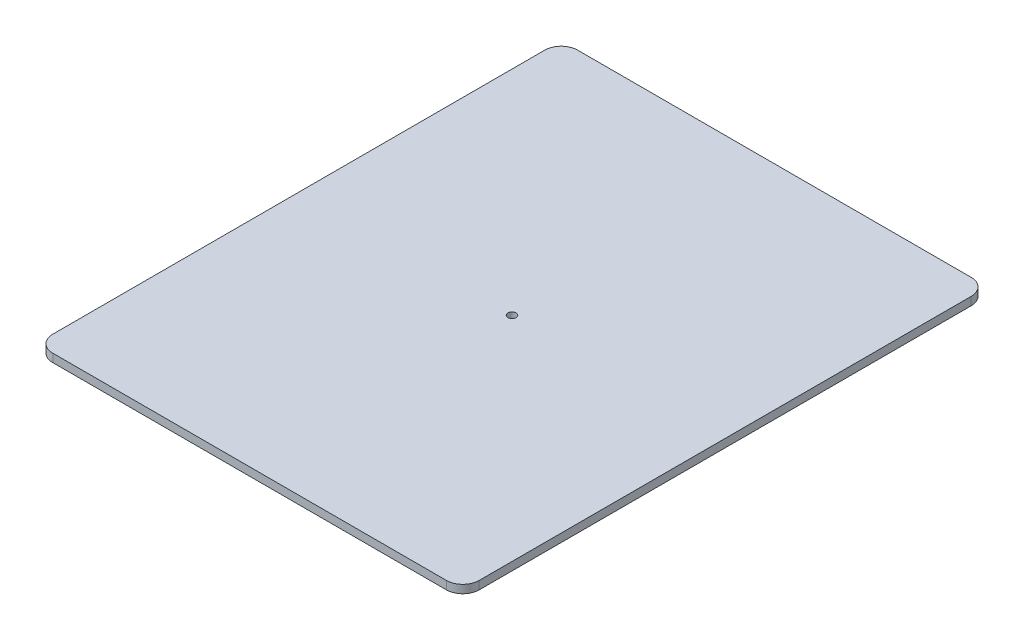
ISO-10303-21;
HEADER;
FILE_DESCRIPTION(('STEP AP214'),'2;1');
FILE_NAME('part.step','',(''),(''),'','','');
FILE_SCHEMA(('AUTOMOTIVE_DESIGN { 1 0 10303 214 1 1 1 1 }'));
ENDSEC;
DATA;
#1=APPLICATION_CONTEXT('core data for automotive mechanical design processes');
#2=APPLICATION_PROTOCOL_DEFINITION('international standard','automotive_design',2000,#1);
#3=PRODUCT_CONTEXT('',#1,'mechanical');
#4=PRODUCT('Part','Part','',(#3));
#5=PRODUCT_RELATED_PRODUCT_CATEGORY('part','',(#4));
#6=PRODUCT_DEFINITION_FORMATION('','',#4);
#7=PRODUCT_DEFINITION_CONTEXT('part definition',#1,'design');
#8=PRODUCT_DEFINITION('design','',#6,#7);
#9=PRODUCT_DEFINITION_SHAPE('','',#8);
#10=(LENGTH_UNIT() NAMED_UNIT(*) SI_UNIT(.MILLI.,.METRE.));
#11=(NAMED_UNIT(*) PLANE_ANGLE_UNIT() SI_UNIT($,.RADIAN.));
#12=(NAMED_UNIT(*) SI_UNIT($,.STERADIAN.) SOLID_ANGLE_UNIT());
#13=UNCERTAINTY_MEASURE_WITH_UNIT(LENGTH_MEASURE(1.E-05),#10,'distance_accuracy_value','');
#14=(GEOMETRIC_REPRESENTATION_CONTEXT(3) GLOBAL_UNCERTAINTY_ASSIGNED_CONTEXT((#13)) GLOBAL_UNIT_ASSIGNED_CONTEXT((#10,
#11,#12)) REPRESENTATION_CONTEXT('',''));
#15=CARTESIAN_POINT('',(0.,0.,0.));
#16=DIRECTION('',(0.,0.,1.));
#17=DIRECTION('',(1.,0.,0.));
#18=AXIS2_PLACEMENT_3D('',#15,#16,#17);
#19=CARTESIAN_POINT('',(-130.,5.,160.));
#20=DIRECTION('',(1.,0.,0.));
#21=DIRECTION('',(0.,0.,-1.));
#22=AXIS2_PLACEMENT_3D('',#19,#20,#21);
#23=PLANE('',#22);
#24=DIRECTION('',(0.,0.,1.));
#25=VECTOR('',#24,1.);
#26=CARTESIAN_POINT('',(-130.,5.,160.));
#27=LINE('',#26,#25);
#28=CARTESIAN_POINT('',(-130.,5.,-150.));
#29=VERTEX_POINT('',#28);
#30=CARTESIAN_POINT('',(-130.,5.,150.));
#31=VERTEX_POINT('',#30);
#32=EDGE_CURVE('E125',#29,#31,#27,.T.);
#33=ORIENTED_EDGE('',*,*,#32,.F.);
#34=DIRECTION('',(0.,-1.,0.));
#35=VECTOR('',#34,1.);
#36=CARTESIAN_POINT('',(-130.,5.,-150.));
#37=LINE('',#36,#35);
#38=CARTESIAN_POINT('',(-130.,0.,-150.));
#39=VERTEX_POINT('',#38);
#40=EDGE_CURVE('E110',#29,#39,#37,.T.);
#41=ORIENTED_EDGE('',*,*,#40,.T.);
#42=DIRECTION('',(0.,0.,1.));
#43=VECTOR('',#42,1.);
#44=CARTESIAN_POINT('',(-130.,0.,160.));
#45=LINE('',#44,#43);
#46=CARTESIAN_POINT('',(-130.,0.,150.));
#47=VERTEX_POINT('',#46);
#48=EDGE_CURVE('E122',#39,#47,#45,.T.);
#49=ORIENTED_EDGE('',*,*,#48,.T.);
#50=DIRECTION('',(0.,-1.,0.));
#51=VECTOR('',#50,1.);
#52=CARTESIAN_POINT('',(-130.,5.,150.));
#53=LINE('',#52,#51);
#54=EDGE_CURVE('E127',#47,#31,#53,.F.);
#55=ORIENTED_EDGE('',*,*,#54,.T.);
#56=EDGE_LOOP('',(#33,#41,#49,#55));
#57=FACE_BOUND('',#56,.T.);
#58=ADVANCED_FACE('F39',(#57),#23,.F.);
#59=CARTESIAN_POINT('',(130.,5.,160.));
#60=DIRECTION('',(0.,0.,-1.));
#61=DIRECTION('',(-1.,0.,0.));
#62=AXIS2_PLACEMENT_3D('',#59,#60,#61);
#63=PLANE('',#62);
#64=DIRECTION('',(1.,0.,0.));
#65=VECTOR('',#64,1.);
#66=CARTESIAN_POINT('',(130.,5.,160.));
#67=LINE('',#66,#65);
#68=CARTESIAN_POINT('',(-120.,5.,160.));
#69=VERTEX_POINT('',#68);
#70=CARTESIAN_POINT('',(120.,5.,160.));
#71=VERTEX_POINT('',#70);
#72=EDGE_CURVE('E169',#69,#71,#67,.T.);
#73=ORIENTED_EDGE('',*,*,#72,.F.);
#74=DIRECTION('',(0.,-1.,0.));
#75=VECTOR('',#74,1.);
#76=CARTESIAN_POINT('',(-120.,5.,160.));
#77=LINE('',#76,#75);
#78=CARTESIAN_POINT('',(-120.,0.,160.));
#79=VERTEX_POINT('',#78);
#80=EDGE_CURVE('E11',#69,#79,#77,.T.);
#81=ORIENTED_EDGE('',*,*,#80,.T.);
#82=DIRECTION('',(1.,0.,0.));
#83=VECTOR('',#82,1.);
#84=CARTESIAN_POINT('',(130.,0.,160.));
#85=LINE('',#84,#83);
#86=CARTESIAN_POINT('',(120.,0.,160.));
#87=VERTEX_POINT('',#86);
#88=EDGE_CURVE('E132',#79,#87,#85,.T.);
#89=ORIENTED_EDGE('',*,*,#88,.T.);
#90=DIRECTION('',(0.,-1.,0.));
#91=VECTOR('',#90,1.);
#92=CARTESIAN_POINT('',(120.,5.,160.));
#93=LINE('',#92,#91);
#94=EDGE_CURVE('E47',#87,#71,#93,.F.);
#95=ORIENTED_EDGE('',*,*,#94,.T.);
#96=EDGE_LOOP('',(#73,#81,#89,#95));
#97=FACE_BOUND('',#96,.T.);
#98=ADVANCED_FACE('F168',(#97),#63,.F.);
#99=CARTESIAN_POINT('',(130.,5.,160.));
#100=DIRECTION('',(-1.,0.,0.));
#101=DIRECTION('',(0.,0.,1.));
#102=AXIS2_PLACEMENT_3D('',#99,#100,#101);
#103=PLANE('',#102);
#104=DIRECTION('',(0.,0.,-1.));
#105=VECTOR('',#104,1.);
#106=CARTESIAN_POINT('',(130.,0.,160.));
#107=LINE('',#106,#105);
#108=CARTESIAN_POINT('',(130.,0.,150.));
#109=VERTEX_POINT('',#108);
#110=CARTESIAN_POINT('',(130.,0.,-150.));
#111=VERTEX_POINT('',#110);
#112=EDGE_CURVE('E136',#109,#111,#107,.T.);
#113=ORIENTED_EDGE('',*,*,#112,.T.);
#114=DIRECTION('',(0.,-1.,0.));
#115=VECTOR('',#114,1.);
#116=CARTESIAN_POINT('',(130.,5.,-150.));
#117=LINE('',#116,#115);
#118=CARTESIAN_POINT('',(130.,5.,-150.));
#119=VERTEX_POINT('',#118);
#120=EDGE_CURVE('E54',#111,#119,#117,.F.);
#121=ORIENTED_EDGE('',*,*,#120,.T.);
#122=DIRECTION('',(0.,0.,-1.));
#123=VECTOR('',#122,1.);
#124=CARTESIAN_POINT('',(130.,5.,160.));
#125=LINE('',#124,#123);
#126=CARTESIAN_POINT('',(130.,5.,150.));
#127=VERTEX_POINT('',#126);
#128=EDGE_CURVE('E175',#127,#119,#125,.T.);
#129=ORIENTED_EDGE('',*,*,#128,.F.);
#130=DIRECTION('',(0.,-1.,0.));
#131=VECTOR('',#130,1.);
#132=CARTESIAN_POINT('',(130.,5.,150.));
#133=LINE('',#132,#131);
#134=EDGE_CURVE('E162',#127,#109,#133,.T.);
#135=ORIENTED_EDGE('',*,*,#134,.T.);
#136=EDGE_LOOP('',(#113,#121,#129,#135));
#137=FACE_BOUND('',#136,.T.);
#138=ADVANCED_FACE('F179',(#137),#103,.F.);
#139=CARTESIAN_POINT('',(130.,5.,-160.));
#140=DIRECTION('',(0.,0.,1.));
#141=DIRECTION('',(1.,0.,0.));
#142=AXIS2_PLACEMENT_3D('',#139,#140,#141);
#143=PLANE('',#142);
#144=DIRECTION('',(-1.,0.,0.));
#145=VECTOR('',#144,1.);
#146=CARTESIAN_POINT('',(130.,0.,-160.));
#147=LINE('',#146,#145);
#148=CARTESIAN_POINT('',(120.,0.,-160.));
#149=VERTEX_POINT('',#148);
#150=CARTESIAN_POINT('',(-120.,0.,-160.));
#151=VERTEX_POINT('',#150);
#152=EDGE_CURVE('E146',#149,#151,#147,.T.);
#153=ORIENTED_EDGE('',*,*,#152,.T.);
#154=DIRECTION('',(0.,-1.,0.));
#155=VECTOR('',#154,1.);
#156=CARTESIAN_POINT('',(-120.,5.,-160.));
#157=LINE('',#156,#155);
#158=CARTESIAN_POINT('',(-120.,5.,-160.));
#159=VERTEX_POINT('',#158);
#160=EDGE_CURVE('E111',#151,#159,#157,.F.);
#161=ORIENTED_EDGE('',*,*,#160,.T.);
#162=DIRECTION('',(-1.,0.,0.));
#163=VECTOR('',#162,1.);
#164=CARTESIAN_POINT('',(130.,5.,-160.));
#165=LINE('',#164,#163);
#166=CARTESIAN_POINT('',(120.,5.,-160.));
#167=VERTEX_POINT('',#166);
#168=EDGE_CURVE('E142',#167,#159,#165,.T.);
#169=ORIENTED_EDGE('',*,*,#168,.F.);
#170=DIRECTION('',(0.,-1.,0.));
#171=VECTOR('',#170,1.);
#172=CARTESIAN_POINT('',(120.,5.,-160.));
#173=LINE('',#172,#171);
#174=EDGE_CURVE('E116',#167,#149,#173,.T.);
#175=ORIENTED_EDGE('',*,*,#174,.T.);
#176=EDGE_LOOP('',(#153,#161,#169,#175));
#177=FACE_BOUND('',#176,.T.);
#178=ADVANCED_FACE('F186',(#177),#143,.F.);
#179=CARTESIAN_POINT('',(0.,5.,0.));
#180=DIRECTION('',(0.,1.,0.));
#181=DIRECTION('',(0.,0.,1.));
#182=AXIS2_PLACEMENT_3D('',#179,#180,#181);
#183=PLANE('',#182);
#184=CARTESIAN_POINT('',(0.,5.,0.));
#185=DIRECTION('',(0.,1.,0.));
#186=DIRECTION('',(0.,0.,1.));
#187=AXIS2_PLACEMENT_3D('',#184,#185,#186);
#188=CIRCLE('',#187,2.5);
#189=CARTESIAN_POINT('',(0.,5.,2.5));
#190=VERTEX_POINT('',#189);
#191=EDGE_CURVE('E139',#190,#190,#188,.T.);
#192=ORIENTED_EDGE('',*,*,#191,.F.);
#193=EDGE_LOOP('',(#192));
#194=FACE_BOUND('',#193,.T.);
#195=ORIENTED_EDGE('',*,*,#168,.T.);
#196=CARTESIAN_POINT('',(-120.,5.,-150.));
#197=DIRECTION('',(0.,1.,0.));
#198=DIRECTION('',(0.,0.,1.));
#199=AXIS2_PLACEMENT_3D('',#196,#197,#198);
#200=CIRCLE('',#199,10.);
#201=EDGE_CURVE('E160',#159,#29,#200,.T.);
#202=ORIENTED_EDGE('',*,*,#201,.T.);
#203=ORIENTED_EDGE('',*,*,#32,.T.);
#204=CARTESIAN_POINT('',(-120.,5.,150.));
#205=DIRECTION('',(0.,1.,0.));
#206=DIRECTION('',(0.,0.,1.));
#207=AXIS2_PLACEMENT_3D('',#204,#205,#206);
#208=CIRCLE('',#207,10.);
#209=EDGE_CURVE('E156',#31,#69,#208,.T.);
#210=ORIENTED_EDGE('',*,*,#209,.T.);
#211=ORIENTED_EDGE('',*,*,#72,.T.);
#212=CARTESIAN_POINT('',(120.,5.,150.));
#213=DIRECTION('',(0.,1.,0.));
#214=DIRECTION('',(0.,0.,1.));
#215=AXIS2_PLACEMENT_3D('',#212,#213,#214);
#216=CIRCLE('',#215,10.);
#217=EDGE_CURVE('E61',#71,#127,#216,.T.);
#218=ORIENTED_EDGE('',*,*,#217,.T.);
#219=ORIENTED_EDGE('',*,*,#128,.T.);
#220=CARTESIAN_POINT('',(120.,5.,-150.));
#221=DIRECTION('',(0.,1.,0.));
#222=DIRECTION('',(0.,0.,1.));
#223=AXIS2_PLACEMENT_3D('',#220,#221,#222);
#224=CIRCLE('',#223,10.);
#225=EDGE_CURVE('E158',#119,#167,#224,.T.);
#226=ORIENTED_EDGE('',*,*,#225,.T.);
#227=EDGE_LOOP('',(#195,#202,#203,#210,#211,#218,#219,#226));
#228=FACE_BOUND('',#227,.T.);
#229=ADVANCED_FACE('F173',(#194,#228),#183,.T.);
#230=CARTESIAN_POINT('',(0.,0.,0.));
#231=DIRECTION('',(0.,1.,0.));
#232=DIRECTION('',(0.,0.,1.));
#233=AXIS2_PLACEMENT_3D('',#230,#231,#232);
#234=PLANE('',#233);
#235=CARTESIAN_POINT('',(0.,0.,0.));
#236=DIRECTION('',(0.,1.,0.));
#237=DIRECTION('',(0.,0.,1.));
#238=AXIS2_PLACEMENT_3D('',#235,#236,#237);
#239=CIRCLE('',#238,2.5);
#240=CARTESIAN_POINT('',(0.,0.,2.5));
#241=VERTEX_POINT('',#240);
#242=EDGE_CURVE('E133',#241,#241,#239,.T.);
#243=ORIENTED_EDGE('',*,*,#242,.T.);
#244=EDGE_LOOP('',(#243));
#245=FACE_BOUND('',#244,.T.);
#246=ORIENTED_EDGE('',*,*,#48,.F.);
#247=CARTESIAN_POINT('',(-120.,0.,-150.));
#248=DIRECTION('',(0.,1.,0.));
#249=DIRECTION('',(0.,0.,1.));
#250=AXIS2_PLACEMENT_3D('',#247,#248,#249);
#251=CIRCLE('',#250,10.);
#252=EDGE_CURVE('E106',#39,#151,#251,.F.);
#253=ORIENTED_EDGE('',*,*,#252,.T.);
#254=ORIENTED_EDGE('',*,*,#152,.F.);
#255=CARTESIAN_POINT('',(120.,0.,-150.));
#256=DIRECTION('',(0.,1.,0.));
#257=DIRECTION('',(0.,0.,1.));
#258=AXIS2_PLACEMENT_3D('',#255,#256,#257);
#259=CIRCLE('',#258,10.);
#260=EDGE_CURVE('E117',#149,#111,#259,.F.);
#261=ORIENTED_EDGE('',*,*,#260,.T.);
#262=ORIENTED_EDGE('',*,*,#112,.F.);
#263=CARTESIAN_POINT('',(120.,0.,150.));
#264=DIRECTION('',(0.,1.,0.));
#265=DIRECTION('',(0.,0.,1.));
#266=AXIS2_PLACEMENT_3D('',#263,#264,#265);
#267=CIRCLE('',#266,10.);
#268=EDGE_CURVE('E126',#109,#87,#267,.F.);
#269=ORIENTED_EDGE('',*,*,#268,.T.);
#270=ORIENTED_EDGE('',*,*,#88,.F.);
#271=CARTESIAN_POINT('',(-120.,0.,150.));
#272=DIRECTION('',(0.,1.,0.));
#273=DIRECTION('',(0.,0.,1.));
#274=AXIS2_PLACEMENT_3D('',#271,#272,#273);
#275=CIRCLE('',#274,10.);
#276=EDGE_CURVE('E131',#79,#47,#275,.F.);
#277=ORIENTED_EDGE('',*,*,#276,.T.);
#278=EDGE_LOOP('',(#246,#253,#254,#261,#262,#269,#270,#277));
#279=FACE_BOUND('',#278,.T.);
#280=ADVANCED_FACE('F129',(#245,#279),#234,.F.);
#281=CARTESIAN_POINT('',(-120.,5.,-150.));
#282=DIRECTION('',(0.,-1.,0.));
#283=DIRECTION('',(0.,0.,-1.));
#284=AXIS2_PLACEMENT_3D('',#281,#282,#283);
#285=CYLINDRICAL_SURFACE('',#284,10.);
#286=ORIENTED_EDGE('',*,*,#201,.F.);
#287=ORIENTED_EDGE('',*,*,#160,.F.);
#288=ORIENTED_EDGE('',*,*,#252,.F.);
#289=ORIENTED_EDGE('',*,*,#40,.F.);
#290=EDGE_LOOP('',(#286,#287,#288,#289));
#291=FACE_BOUND('',#290,.T.);
#292=ADVANCED_FACE('F109',(#291),#285,.T.);
#293=CARTESIAN_POINT('',(120.,5.,-150.));
#294=DIRECTION('',(0.,-1.,0.));
#295=DIRECTION('',(0.,0.,-1.));
#296=AXIS2_PLACEMENT_3D('',#293,#294,#295);
#297=CYLINDRICAL_SURFACE('',#296,10.);
#298=ORIENTED_EDGE('',*,*,#225,.F.);
#299=ORIENTED_EDGE('',*,*,#120,.F.);
#300=ORIENTED_EDGE('',*,*,#260,.F.);
#301=ORIENTED_EDGE('',*,*,#174,.F.);
#302=EDGE_LOOP('',(#298,#299,#300,#301));
#303=FACE_BOUND('',#302,.T.);
#304=ADVANCED_FACE('F183',(#303),#297,.T.);
#305=CARTESIAN_POINT('',(-120.,5.,150.));
#306=DIRECTION('',(0.,-1.,0.));
#307=DIRECTION('',(0.,0.,-1.));
#308=AXIS2_PLACEMENT_3D('',#305,#306,#307);
#309=CYLINDRICAL_SURFACE('',#308,10.);
#310=ORIENTED_EDGE('',*,*,#209,.F.);
#311=ORIENTED_EDGE('',*,*,#54,.F.);
#312=ORIENTED_EDGE('',*,*,#276,.F.);
#313=ORIENTED_EDGE('',*,*,#80,.F.);
#314=EDGE_LOOP('',(#310,#311,#312,#313));
#315=FACE_BOUND('',#314,.T.);
#316=ADVANCED_FACE('F216',(#315),#309,.T.);
#317=CARTESIAN_POINT('',(120.,5.,150.));
#318=DIRECTION('',(0.,-1.,0.));
#319=DIRECTION('',(0.,0.,-1.));
#320=AXIS2_PLACEMENT_3D('',#317,#318,#319);
#321=CYLINDRICAL_SURFACE('',#320,10.);
#322=ORIENTED_EDGE('',*,*,#217,.F.);
#323=ORIENTED_EDGE('',*,*,#94,.F.);
#324=ORIENTED_EDGE('',*,*,#268,.F.);
#325=ORIENTED_EDGE('',*,*,#134,.F.);
#326=EDGE_LOOP('',(#322,#323,#324,#325));
#327=FACE_BOUND('',#326,.T.);
#328=ADVANCED_FACE('F41',(#327),#321,.T.);
#329=CARTESIAN_POINT('',(0.,0.,0.));
#330=DIRECTION('',(0.,1.,0.));
#331=DIRECTION('',(0.,0.,1.));
#332=AXIS2_PLACEMENT_3D('',#329,#330,#331);
#333=CYLINDRICAL_SURFACE('',#332,2.5);
#334=ORIENTED_EDGE('',*,*,#242,.F.);
#335=EDGE_LOOP('',(#334));
#336=FACE_BOUND('',#335,.T.);
#337=ORIENTED_EDGE('',*,*,#191,.T.);
#338=EDGE_LOOP('',(#337));
#339=FACE_BOUND('',#338,.T.);
#340=ADVANCED_FACE('F192',(#336,#339),#333,.F.);
#341=CLOSED_SHELL('',(#58,#98,#138,#178,#229,#280,#292,#304,#316,#328,#340));
#342=MANIFOLD_SOLID_BREP('B2',#341);
#343=ADVANCED_BREP_SHAPE_REPRESENTATION('',(#18,#342),#14);
#344=SHAPE_DEFINITION_REPRESENTATION(#9,#343);
ENDSEC;
END-ISO-10303-21;
